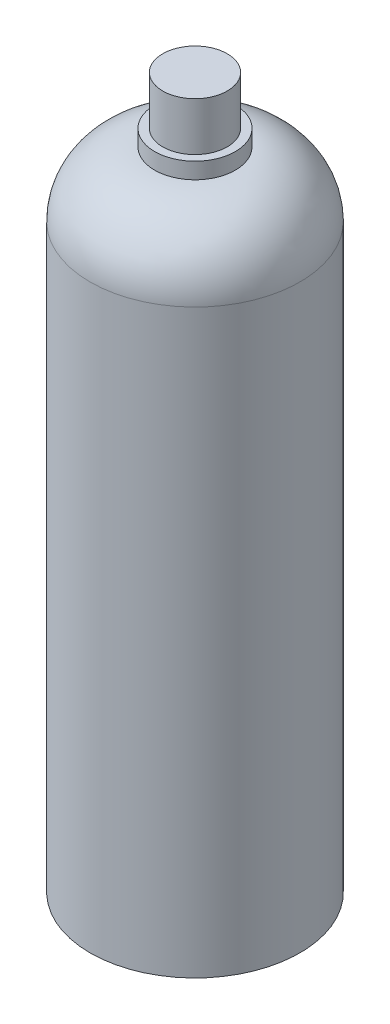
ISO-10303-21;
HEADER;
FILE_DESCRIPTION(('STEP AP214'),'2;1');
FILE_NAME('part.step','',(''),(''),'','','');
FILE_SCHEMA(('AUTOMOTIVE_DESIGN { 1 0 10303 214 1 1 1 1 }'));
ENDSEC;
DATA;
#1=APPLICATION_CONTEXT('core data for automotive mechanical design processes');
#2=APPLICATION_PROTOCOL_DEFINITION('international standard','automotive_design',2000,#1);
#3=PRODUCT_CONTEXT('',#1,'mechanical');
#4=PRODUCT('Part','Part','',(#3));
#5=PRODUCT_RELATED_PRODUCT_CATEGORY('part','',(#4));
#6=PRODUCT_DEFINITION_FORMATION('','',#4);
#7=PRODUCT_DEFINITION_CONTEXT('part definition',#1,'design');
#8=PRODUCT_DEFINITION('design','',#6,#7);
#9=PRODUCT_DEFINITION_SHAPE('','',#8);
#10=(LENGTH_UNIT() NAMED_UNIT(*) SI_UNIT(.MILLI.,.METRE.));
#11=(NAMED_UNIT(*) PLANE_ANGLE_UNIT() SI_UNIT($,.RADIAN.));
#12=(NAMED_UNIT(*) SI_UNIT($,.STERADIAN.) SOLID_ANGLE_UNIT());
#13=UNCERTAINTY_MEASURE_WITH_UNIT(LENGTH_MEASURE(1.E-05),#10,'distance_accuracy_value','');
#14=(GEOMETRIC_REPRESENTATION_CONTEXT(3) GLOBAL_UNCERTAINTY_ASSIGNED_CONTEXT((#13)) GLOBAL_UNIT_ASSIGNED_CONTEXT((#10,
#11,#12)) REPRESENTATION_CONTEXT('',''));
#15=CARTESIAN_POINT('',(0.,0.,0.));
#16=DIRECTION('',(0.,0.,1.));
#17=DIRECTION('',(1.,0.,0.));
#18=AXIS2_PLACEMENT_3D('',#15,#16,#17);
#19=CARTESIAN_POINT('',(0.,220.,0.));
#20=DIRECTION('',(0.,-1.,0.));
#21=DIRECTION('',(0.,0.,-1.));
#22=AXIS2_PLACEMENT_3D('',#19,#20,#21);
#23=CYLINDRICAL_SURFACE('',#22,10.);
#24=CARTESIAN_POINT('',(0.,205.,0.));
#25=DIRECTION('',(0.,1.,0.));
#26=DIRECTION('',(0.,0.,1.));
#27=AXIS2_PLACEMENT_3D('',#24,#25,#26);
#28=CIRCLE('',#27,10.);
#29=CARTESIAN_POINT('',(0.,205.,10.));
#30=VERTEX_POINT('',#29);
#31=EDGE_CURVE('E68',#30,#30,#28,.T.);
#32=ORIENTED_EDGE('',*,*,#31,.T.);
#33=EDGE_LOOP('',(#32));
#34=FACE_BOUND('',#33,.T.);
#35=CARTESIAN_POINT('',(0.,220.,0.));
#36=DIRECTION('',(0.,1.,0.));
#37=DIRECTION('',(0.,0.,1.));
#38=AXIS2_PLACEMENT_3D('',#35,#36,#37);
#39=CIRCLE('',#38,10.);
#40=CARTESIAN_POINT('',(0.,220.,10.));
#41=VERTEX_POINT('',#40);
#42=EDGE_CURVE('E59',#41,#41,#39,.T.);
#43=ORIENTED_EDGE('',*,*,#42,.F.);
#44=EDGE_LOOP('',(#43));
#45=FACE_BOUND('',#44,.T.);
#46=CARTESIAN_POINT('',(0.,217.5,-10.));
#47=CARTESIAN_POINT('',(0.138126814449553,217.49999612377,-9.99999766446687));
#48=CARTESIAN_POINT('',(0.27629692971794,217.488514082044,-9.99710963553044));
#49=CARTESIAN_POINT('',(0.548677206284222,217.442958081155,-9.98586856383157));
#50=CARTESIAN_POINT('',(0.682885078117898,217.408871317437,-9.97751242366627));
#51=CARTESIAN_POINT('',(0.943368120304293,217.319267910897,-9.9562604388672));
#52=CARTESIAN_POINT('',(1.06965260571667,217.263777002141,-9.94337004736764));
#53=CARTESIAN_POINT('',(1.31112021984071,217.133031016592,-9.91442239679369));
#54=CARTESIAN_POINT('',(1.4263029739146,217.057775273135,-9.89836503090261));
#55=CARTESIAN_POINT('',(1.64466987883486,216.88799868391,-9.86445689319489));
#56=CARTESIAN_POINT('',(1.74759281676843,216.793147375068,-9.84657845246877));
#57=CARTESIAN_POINT('',(1.93624821200553,216.587579658485,-9.8112270019656));
#58=CARTESIAN_POINT('',(2.02197872824865,216.476861461755,-9.79375403816446));
#59=CARTESIAN_POINT('',(2.1750442379983,216.240674622105,-9.76091292830281));
#60=CARTESIAN_POINT('',(2.24208702654191,216.115011281985,-9.74557990774685));
#61=CARTESIAN_POINT('',(2.35399484758458,215.853752647233,-9.71915824696694));
#62=CARTESIAN_POINT('',(2.39886342573357,215.718158944447,-9.70806892824031));
#63=CARTESIAN_POINT('',(2.46425806134127,215.443760836331,-9.69167461160538));
#64=CARTESIAN_POINT('',(2.48525378055342,215.30507517327,-9.68625818328352));
#65=CARTESIAN_POINT('',(2.50376962511068,215.026052385001,-9.68148937432652));
#66=CARTESIAN_POINT('',(2.50129356969685,214.88571553218,-9.68213600713214));
#67=CARTESIAN_POINT('',(2.47331087439951,214.610973653758,-9.68932009194695));
#68=CARTESIAN_POINT('',(2.44836390031772,214.476507297558,-9.69571438345489));
#69=CARTESIAN_POINT('',(2.37704031150499,214.213731581815,-9.71344516118448));
#70=CARTESIAN_POINT('',(2.33066217011566,214.085422661618,-9.72478199948731));
#71=CARTESIAN_POINT('',(2.21731579656199,213.837103306246,-9.75125189842765));
#72=CARTESIAN_POINT('',(2.15014444538821,213.717189713684,-9.76642212449693));
#73=CARTESIAN_POINT('',(1.99726046002492,213.490135483739,-9.79882851409985));
#74=CARTESIAN_POINT('',(1.91154458134807,213.382997086555,-9.81606503891047));
#75=CARTESIAN_POINT('',(1.72110570780204,213.181327307176,-9.85126467566485));
#76=CARTESIAN_POINT('',(1.61591043027644,213.087242516564,-9.86923449130001));
#77=CARTESIAN_POINT('',(1.39101986250617,212.917964595894,-9.90343275964594));
#78=CARTESIAN_POINT('',(1.27132412951324,212.842772042894,-9.91966115915679));
#79=CARTESIAN_POINT('',(1.02019314780232,212.713249022959,-9.94862886823651));
#80=CARTESIAN_POINT('',(0.888718988681044,212.658991099576,-9.96135600212878));
#81=CARTESIAN_POINT('',(0.618126680238137,212.573471157151,-9.98179861652361));
#82=CARTESIAN_POINT('',(0.479009998584135,212.542204739303,-9.98951505565468));
#83=CARTESIAN_POINT('',(0.200899950650036,212.504237390735,-9.99892498785624));
#84=CARTESIAN_POINT('',(0.061994533313677,212.496928289874,-10.0007675584713));
#85=CARTESIAN_POINT('',(-0.21505479133585,212.505415003426,-9.99864674690754));
#86=CARTESIAN_POINT('',(-0.353198766074329,212.521208737999,-9.99468388736421));
#87=CARTESIAN_POINT('',(-0.622690447960819,212.574951513986,-9.98149301878918));
#88=CARTESIAN_POINT('',(-0.754108531614585,212.612568772462,-9.97234390309647));
#89=CARTESIAN_POINT('',(-1.00876215408753,212.708511806714,-9.94981177723595));
#90=CARTESIAN_POINT('',(-1.13199686505443,212.766839673855,-9.93642833949965));
#91=CARTESIAN_POINT('',(-1.36920522404971,212.903726881458,-9.9065551321037));
#92=CARTESIAN_POINT('',(-1.48297573639293,212.982626853994,-9.89001445610999));
#93=CARTESIAN_POINT('',(-1.6958776894055,213.157983181329,-9.85574181979587));
#94=CARTESIAN_POINT('',(-1.79500659828874,213.254442566029,-9.83800965421578));
#95=CARTESIAN_POINT('',(-1.97831761345414,213.465003268073,-9.80281594932498));
#96=CARTESIAN_POINT('',(-2.06207311270184,213.579479504999,-9.78537173637463));
#97=CARTESIAN_POINT('',(-2.20918459835604,213.821221057448,-9.75321463970069));
#98=CARTESIAN_POINT('',(-2.27254149026901,213.948485804951,-9.73850163474941));
#99=CARTESIAN_POINT('',(-2.37658570101224,214.211509537344,-9.71363491194665));
#100=CARTESIAN_POINT('',(-2.41740732773931,214.347212713854,-9.70345425375809));
#101=CARTESIAN_POINT('',(-2.47557609990489,214.623849396425,-9.68877906706586));
#102=CARTESIAN_POINT('',(-2.49292837912652,214.764781751702,-9.68428329504044));
#103=CARTESIAN_POINT('',(-2.50339765056083,215.043535039769,-9.68158168701612));
#104=CARTESIAN_POINT('',(-2.49719649630132,215.181329058544,-9.68319887888034));
#105=CARTESIAN_POINT('',(-2.46229546385366,215.453839814444,-9.69213181672143));
#106=CARTESIAN_POINT('',(-2.43359603781098,215.588556613355,-9.69944744817731));
#107=CARTESIAN_POINT('',(-2.35488553240495,215.850347431776,-9.71885434473222));
#108=CARTESIAN_POINT('',(-2.30500234113403,215.977462175401,-9.73091692061057));
#109=CARTESIAN_POINT('',(-2.18544152267503,216.221608971189,-9.7584625954084));
#110=CARTESIAN_POINT('',(-2.11576115005696,216.338639621978,-9.77394616867808));
#111=CARTESIAN_POINT('',(-1.95644624772858,216.562591048337,-9.80709390439337));
#112=CARTESIAN_POINT('',(-1.86633860485376,216.669168455707,-9.82480441386302));
#113=CARTESIAN_POINT('',(-1.66964895198287,216.865911741326,-9.86013378743769));
#114=CARTESIAN_POINT('',(-1.56306303543523,216.956073716855,-9.87775262878422));
#115=CARTESIAN_POINT('',(-1.33411264450431,217.119018847608,-9.91129426079449));
#116=CARTESIAN_POINT('',(-1.21149737052731,217.191457689453,-9.92718055609783));
#117=CARTESIAN_POINT('',(-0.955443432517464,217.314579104901,-9.95508208291861));
#118=CARTESIAN_POINT('',(-0.822012605727904,217.365277267748,-9.96710008666301));
#119=CARTESIAN_POINT('',(-0.574017088739126,217.435953050549,-9.98413432609236));
#120=CARTESIAN_POINT('',(-0.460633618180121,217.459918738422,-9.99004308421151));
#121=CARTESIAN_POINT('',(-0.231510119227143,217.49194323937,-9.9979767538658));
#122=CARTESIAN_POINT('',(-0.115770268737696,217.500003248842,-10.0000019575149));
#123=CARTESIAN_POINT('',(0.,217.5,-10.));
#124=B_SPLINE_CURVE_WITH_KNOTS('',3,(#46,#47,#48,#49,#50,#51,#52,#53,#54,#55,#56,#57,#58,#59,
#60,#61,#62,#63,#64,#65,#66,#67,#68,#69,#70,#71,#72,#73,#74,#75,#76,#77,#78,#79,#80,#81,#82,#83,
#84,#85,#86,#87,#88,#89,#90,#91,#92,#93,#94,#95,#96,#97,#98,#99,#100,#101,#102,#103,#104,#105,
#106,#107,#108,#109,#110,#111,#112,#113,#114,#115,#116,#117,#118,#119,#120,#121,#122,#123),
.UNSPECIFIED.,.T.,.F.,(4,2,2,2,2,2,2,2,2,2,2,2,2,2,2,2,2,2,2,2,2,2,2,2,2,2,2,2,2,2,2,2,2,2,2,2,
2,2,4),(0.,0.413956187453151,0.828147062939834,1.24184150381017,1.65554990028221,
2.07690725728567,2.4983121596677,2.92597745909682,3.3535743528228,3.77260491835115,
4.19156730193363,4.6003749501723,5.0092117244893,5.42217546462,5.83521151399138,
6.26002501620566,6.68485149269279,7.11113715020725,7.53734122819941,7.95263848254329,
8.3678983519344,8.77700457528931,9.18615212209352,9.6025597928112,10.0190393835223,
10.44574182013,10.8724253125472,11.2965375769764,11.7205570543047,12.1323963400749,
12.5442273493652,12.9536066760888,13.3630428023797,13.7831596069298,14.2033761629383,
14.6312030917578,15.0587227304538,15.4057040491338,15.752659267482),.UNSPECIFIED.);
#125=CARTESIAN_POINT('',(0.,217.5,-10.));
#126=VERTEX_POINT('',#125);
#127=EDGE_CURVE('E10',#126,#126,#124,.T.);
#128=ORIENTED_EDGE('',*,*,#127,.F.);
#129=EDGE_LOOP('',(#128));
#130=FACE_BOUND('',#129,.T.);
#131=ADVANCED_FACE('F34',(#34,#45,#130),#23,.T.);
#132=CARTESIAN_POINT('',(0.,220.,0.));
#133=DIRECTION('',(0.,1.,0.));
#134=DIRECTION('',(0.,0.,1.));
#135=AXIS2_PLACEMENT_3D('',#132,#133,#134);
#136=PLANE('',#135);
#137=ORIENTED_EDGE('',*,*,#42,.T.);
#138=EDGE_LOOP('',(#137));
#139=FACE_BOUND('',#138,.T.);
#140=ADVANCED_FACE('F91',(#139),#136,.T.);
#141=CARTESIAN_POINT('',(0.,215.,-8.));
#142=DIRECTION('',(0.,0.,-1.));
#143=DIRECTION('',(-1.,0.,0.));
#144=AXIS2_PLACEMENT_3D('',#141,#142,#143);
#145=CYLINDRICAL_SURFACE('',#144,2.5);
#146=CARTESIAN_POINT('',(0.,215.,-8.));
#147=DIRECTION('',(0.,0.,1.));
#148=DIRECTION('',(1.,0.,0.));
#149=AXIS2_PLACEMENT_3D('',#146,#147,#148);
#150=CIRCLE('',#149,2.5);
#151=CARTESIAN_POINT('',(2.5,215.,-8.));
#152=VERTEX_POINT('',#151);
#153=EDGE_CURVE('E62',#152,#152,#150,.T.);
#154=ORIENTED_EDGE('',*,*,#153,.T.);
#155=EDGE_LOOP('',(#154));
#156=FACE_BOUND('',#155,.T.);
#157=ORIENTED_EDGE('',*,*,#127,.T.);
#158=EDGE_LOOP('',(#157));
#159=FACE_BOUND('',#158,.T.);
#160=ADVANCED_FACE('F87',(#156,#159),#145,.F.);
#161=CARTESIAN_POINT('',(0.,215.,-8.));
#162=DIRECTION('',(0.,0.,1.));
#163=DIRECTION('',(1.,0.,0.));
#164=AXIS2_PLACEMENT_3D('',#161,#162,#163);
#165=PLANE('',#164);
#166=ORIENTED_EDGE('',*,*,#153,.F.);
#167=EDGE_LOOP('',(#166));
#168=FACE_BOUND('',#167,.T.);
#169=ADVANCED_FACE('F77',(#168),#165,.F.);
#170=CARTESIAN_POINT('',(0.,205.,0.));
#171=DIRECTION('',(0.,1.,0.));
#172=DIRECTION('',(0.,0.,1.));
#173=AXIS2_PLACEMENT_3D('',#170,#171,#172);
#174=PLANE('',#173);
#175=CARTESIAN_POINT('',(0.,205.,0.));
#176=DIRECTION('',(0.,1.,0.));
#177=DIRECTION('',(0.,0.,1.));
#178=AXIS2_PLACEMENT_3D('',#175,#176,#177);
#179=CIRCLE('',#178,12.5);
#180=CARTESIAN_POINT('',(0.,205.,12.5));
#181=VERTEX_POINT('',#180);
#182=EDGE_CURVE('E65',#181,#181,#179,.T.);
#183=ORIENTED_EDGE('',*,*,#182,.T.);
#184=EDGE_LOOP('',(#183));
#185=FACE_BOUND('',#184,.T.);
#186=ORIENTED_EDGE('',*,*,#31,.F.);
#187=EDGE_LOOP('',(#186));
#188=FACE_BOUND('',#187,.T.);
#189=ADVANCED_FACE('F74',(#185,#188),#174,.T.);
#190=CARTESIAN_POINT('',(0.,205.,0.));
#191=DIRECTION('',(0.,-1.,0.));
#192=DIRECTION('',(0.,0.,-1.));
#193=AXIS2_PLACEMENT_3D('',#190,#191,#192);
#194=CYLINDRICAL_SURFACE('',#193,12.5);
#195=ORIENTED_EDGE('',*,*,#182,.F.);
#196=EDGE_LOOP('',(#195));
#197=FACE_BOUND('',#196,.T.);
#198=CARTESIAN_POINT('',(0.,200.,0.));
#199=DIRECTION('',(0.,1.,0.));
#200=DIRECTION('',(0.,0.,1.));
#201=AXIS2_PLACEMENT_3D('',#198,#199,#200);
#202=CIRCLE('',#201,12.5);
#203=CARTESIAN_POINT('',(0.,200.,12.5));
#204=VERTEX_POINT('',#203);
#205=EDGE_CURVE('E50',#204,#204,#202,.T.);
#206=ORIENTED_EDGE('',*,*,#205,.T.);
#207=EDGE_LOOP('',(#206));
#208=FACE_BOUND('',#207,.T.);
#209=ADVANCED_FACE('F76',(#197,#208),#194,.T.);
#210=CARTESIAN_POINT('',(0.,0.,0.));
#211=DIRECTION('',(0.,1.,0.));
#212=DIRECTION('',(0.,0.,1.));
#213=AXIS2_PLACEMENT_3D('',#210,#211,#212);
#214=PLANE('',#213);
#215=CARTESIAN_POINT('',(0.,0.,0.));
#216=DIRECTION('',(0.,1.,0.));
#217=DIRECTION('',(0.,0.,1.));
#218=AXIS2_PLACEMENT_3D('',#215,#216,#217);
#219=CIRCLE('',#218,32.5);
#220=CARTESIAN_POINT('',(0.,0.,32.5));
#221=VERTEX_POINT('',#220);
#222=EDGE_CURVE('E54',#221,#221,#219,.T.);
#223=ORIENTED_EDGE('',*,*,#222,.F.);
#224=EDGE_LOOP('',(#223));
#225=FACE_BOUND('',#224,.T.);
#226=ADVANCED_FACE('F84',(#225),#214,.F.);
#227=CARTESIAN_POINT('',(0.,200.,0.));
#228=DIRECTION('',(0.,-1.,0.));
#229=DIRECTION('',(0.,0.,-1.));
#230=AXIS2_PLACEMENT_3D('',#227,#228,#229);
#231=CYLINDRICAL_SURFACE('',#230,32.5);
#232=CARTESIAN_POINT('',(0.,180.,0.));
#233=DIRECTION('',(0.,1.,0.));
#234=DIRECTION('',(0.,0.,1.));
#235=AXIS2_PLACEMENT_3D('',#232,#233,#234);
#236=CIRCLE('',#235,32.5);
#237=CARTESIAN_POINT('',(0.,180.,32.5));
#238=VERTEX_POINT('',#237);
#239=EDGE_CURVE('E46',#238,#238,#236,.F.);
#240=ORIENTED_EDGE('',*,*,#239,.T.);
#241=EDGE_LOOP('',(#240));
#242=FACE_BOUND('',#241,.T.);
#243=ORIENTED_EDGE('',*,*,#222,.T.);
#244=EDGE_LOOP('',(#243));
#245=FACE_BOUND('',#244,.T.);
#246=ADVANCED_FACE('F100',(#242,#245),#231,.T.);
#247=CARTESIAN_POINT('',(0.,180.,0.));
#248=DIRECTION('',(0.,1.,0.));
#249=DIRECTION('',(0.,0.,1.));
#250=AXIS2_PLACEMENT_3D('',#247,#248,#249);
#251=DEGENERATE_TOROIDAL_SURFACE('',#250,12.5,20.,.T.);
#252=ORIENTED_EDGE('',*,*,#239,.F.);
#253=EDGE_LOOP('',(#252));
#254=FACE_BOUND('',#253,.T.);
#255=ORIENTED_EDGE('',*,*,#205,.F.);
#256=EDGE_LOOP('',(#255));
#257=FACE_BOUND('',#256,.T.);
#258=ADVANCED_FACE('F36',(#254,#257),#251,.T.);
#259=CLOSED_SHELL('',(#131,#140,#160,#169,#189,#209,#226,#246,#258));
#260=MANIFOLD_SOLID_BREP('B2',#259);
#261=ADVANCED_BREP_SHAPE_REPRESENTATION('',(#18,#260),#14);
#262=SHAPE_DEFINITION_REPRESENTATION(#9,#261);
ENDSEC;
END-ISO-10303-21;
